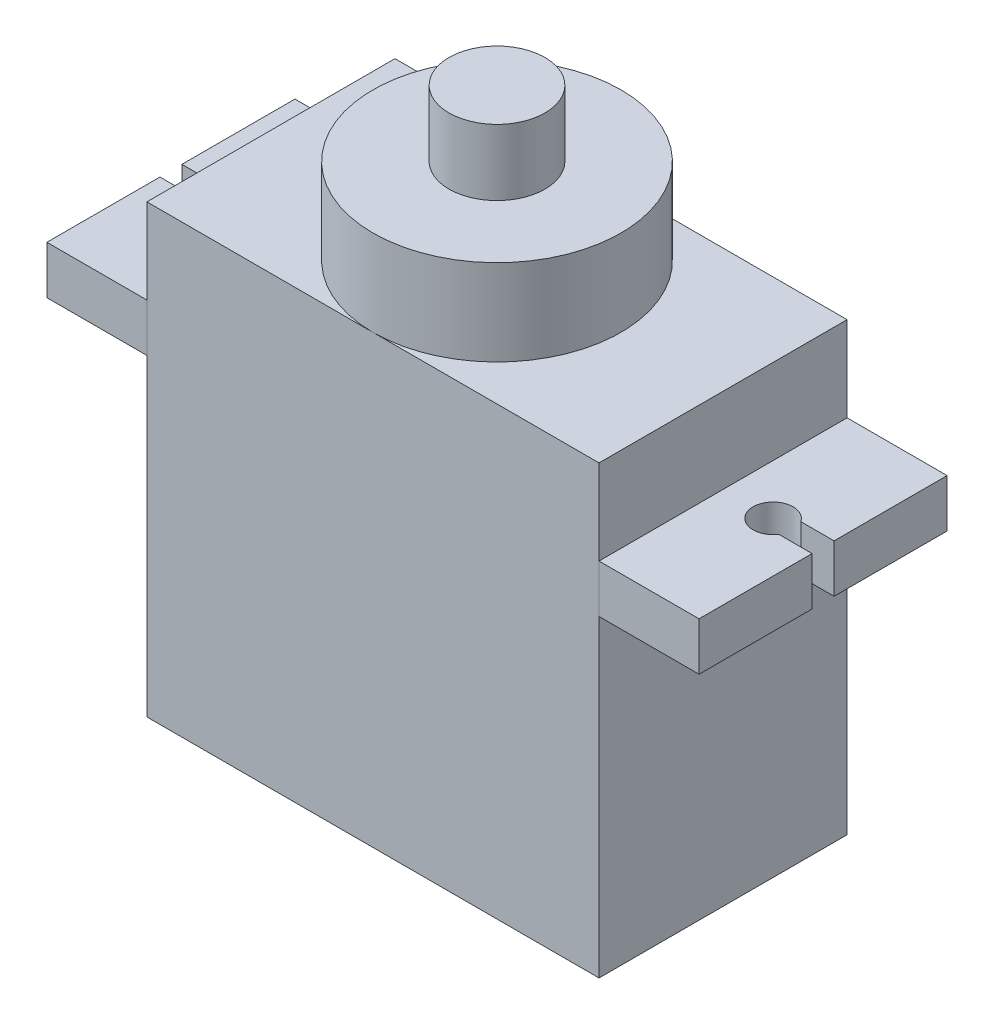
ISO-10303-21;
HEADER;
FILE_DESCRIPTION(('STEP AP214'),'2;1');
FILE_NAME('part.step','',(''),(''),'','','');
FILE_SCHEMA(('AUTOMOTIVE_DESIGN { 1 0 10303 214 1 1 1 1 }'));
ENDSEC;
DATA;
#1=APPLICATION_CONTEXT('core data for automotive mechanical design processes');
#2=APPLICATION_PROTOCOL_DEFINITION('international standard','automotive_design',2000,#1);
#3=PRODUCT_CONTEXT('',#1,'mechanical');
#4=PRODUCT('Part','Part','',(#3));
#5=PRODUCT_RELATED_PRODUCT_CATEGORY('part','',(#4));
#6=PRODUCT_DEFINITION_FORMATION('','',#4);
#7=PRODUCT_DEFINITION_CONTEXT('part definition',#1,'design');
#8=PRODUCT_DEFINITION('design','',#6,#7);
#9=PRODUCT_DEFINITION_SHAPE('','',#8);
#10=(LENGTH_UNIT() NAMED_UNIT(*) SI_UNIT(.MILLI.,.METRE.));
#11=(NAMED_UNIT(*) PLANE_ANGLE_UNIT() SI_UNIT($,.RADIAN.));
#12=(NAMED_UNIT(*) SI_UNIT($,.STERADIAN.) SOLID_ANGLE_UNIT());
#13=UNCERTAINTY_MEASURE_WITH_UNIT(LENGTH_MEASURE(1.E-05),#10,'distance_accuracy_value','');
#14=(GEOMETRIC_REPRESENTATION_CONTEXT(3) GLOBAL_UNCERTAINTY_ASSIGNED_CONTEXT((#13)) GLOBAL_UNIT_ASSIGNED_CONTEXT((#10,
#11,#12)) REPRESENTATION_CONTEXT('',''));
#15=CARTESIAN_POINT('',(0.,0.,0.));
#16=DIRECTION('',(0.,0.,1.));
#17=DIRECTION('',(1.,0.,0.));
#18=AXIS2_PLACEMENT_3D('',#15,#16,#17);
#19=CARTESIAN_POINT('',(-13.6,4.5,-1.2));
#20=DIRECTION('',(1.,0.,0.));
#21=DIRECTION('',(0.,0.,-1.));
#22=AXIS2_PLACEMENT_3D('',#19,#20,#21);
#23=CYLINDRICAL_SURFACE('',#22,0.6);
#24=CARTESIAN_POINT('',(-11.3,4.5,-1.2));
#25=DIRECTION('',(-1.,0.,0.));
#26=DIRECTION('',(0.,0.,1.));
#27=AXIS2_PLACEMENT_3D('',#24,#25,#26);
#28=CIRCLE('',#27,0.6);
#29=CARTESIAN_POINT('',(-11.3,4.5,-0.6));
#30=VERTEX_POINT('',#29);
#31=EDGE_CURVE('E11',#30,#30,#28,.T.);
#32=ORIENTED_EDGE('',*,*,#31,.T.);
#33=EDGE_LOOP('',(#32));
#34=FACE_BOUND('',#33,.T.);
#35=CARTESIAN_POINT('',(-13.6,4.5,-1.2));
#36=DIRECTION('',(-1.,0.,0.));
#37=DIRECTION('',(0.,0.,1.));
#38=AXIS2_PLACEMENT_3D('',#35,#36,#37);
#39=CIRCLE('',#38,0.6);
#40=CARTESIAN_POINT('',(-13.6,4.5,-0.6));
#41=VERTEX_POINT('',#40);
#42=EDGE_CURVE('E60',#41,#41,#39,.T.);
#43=ORIENTED_EDGE('',*,*,#42,.F.);
#44=EDGE_LOOP('',(#43));
#45=FACE_BOUND('',#44,.T.);
#46=ADVANCED_FACE('F56',(#34,#45),#23,.T.);
#47=CARTESIAN_POINT('',(-13.6,0.,0.));
#48=DIRECTION('',(-1.,0.,0.));
#49=DIRECTION('',(0.,0.,1.));
#50=AXIS2_PLACEMENT_3D('',#47,#48,#49);
#51=PLANE('',#50);
#52=ORIENTED_EDGE('',*,*,#42,.T.);
#53=EDGE_LOOP('',(#52));
#54=FACE_BOUND('',#53,.T.);
#55=ADVANCED_FACE('F58',(#54),#51,.T.);
#56=CARTESIAN_POINT('',(-11.3,0.,0.));
#57=DIRECTION('',(-1.,0.,0.));
#58=DIRECTION('',(0.,0.,1.));
#59=AXIS2_PLACEMENT_3D('',#56,#57,#58);
#60=PLANE('',#59);
#61=ORIENTED_EDGE('',*,*,#31,.F.);
#62=EDGE_LOOP('',(#61));
#63=FACE_BOUND('',#62,.T.);
#64=ADVANCED_FACE('F75',(#63),#60,.F.);
#65=CLOSED_SHELL('',(#46,#55,#64));
#66=MANIFOLD_SOLID_BREP('B2',#65);
#67=CARTESIAN_POINT('',(-13.6,4.5,0.));
#68=DIRECTION('',(1.,0.,0.));
#69=DIRECTION('',(0.,0.,-1.));
#70=AXIS2_PLACEMENT_3D('',#67,#68,#69);
#71=CYLINDRICAL_SURFACE('',#70,0.6);
#72=CARTESIAN_POINT('',(-11.3,4.5,0.));
#73=DIRECTION('',(-1.,0.,0.));
#74=DIRECTION('',(0.,0.,1.));
#75=AXIS2_PLACEMENT_3D('',#72,#73,#74);
#76=CIRCLE('',#75,0.6);
#77=CARTESIAN_POINT('',(-11.3,4.5,0.6));
#78=VERTEX_POINT('',#77);
#79=EDGE_CURVE('E55',#78,#78,#76,.T.);
#80=ORIENTED_EDGE('',*,*,#79,.T.);
#81=EDGE_LOOP('',(#80));
#82=FACE_BOUND('',#81,.T.);
#83=CARTESIAN_POINT('',(-13.6,4.5,0.));
#84=DIRECTION('',(-1.,0.,0.));
#85=DIRECTION('',(0.,0.,1.));
#86=AXIS2_PLACEMENT_3D('',#83,#84,#85);
#87=CIRCLE('',#86,0.6);
#88=CARTESIAN_POINT('',(-13.6,4.5,0.6));
#89=VERTEX_POINT('',#88);
#90=EDGE_CURVE('E109',#89,#89,#87,.T.);
#91=ORIENTED_EDGE('',*,*,#90,.F.);
#92=EDGE_LOOP('',(#91));
#93=FACE_BOUND('',#92,.T.);
#94=ADVANCED_FACE('F105',(#82,#93),#71,.T.);
#95=CARTESIAN_POINT('',(-13.6,0.,0.));
#96=DIRECTION('',(-1.,0.,0.));
#97=DIRECTION('',(0.,0.,1.));
#98=AXIS2_PLACEMENT_3D('',#95,#96,#97);
#99=PLANE('',#98);
#100=ORIENTED_EDGE('',*,*,#90,.T.);
#101=EDGE_LOOP('',(#100));
#102=FACE_BOUND('',#101,.T.);
#103=ADVANCED_FACE('F107',(#102),#99,.T.);
#104=CARTESIAN_POINT('',(-11.3,0.,0.));
#105=DIRECTION('',(-1.,0.,0.));
#106=DIRECTION('',(0.,0.,1.));
#107=AXIS2_PLACEMENT_3D('',#104,#105,#106);
#108=PLANE('',#107);
#109=ORIENTED_EDGE('',*,*,#79,.F.);
#110=EDGE_LOOP('',(#109));
#111=FACE_BOUND('',#110,.T.);
#112=ADVANCED_FACE('F124',(#111),#108,.F.);
#113=CLOSED_SHELL('',(#94,#103,#112));
#114=MANIFOLD_SOLID_BREP('B6',#113);
#115=CARTESIAN_POINT('',(-13.6,4.5,1.2));
#116=DIRECTION('',(1.,0.,0.));
#117=DIRECTION('',(0.,0.,-1.));
#118=AXIS2_PLACEMENT_3D('',#115,#116,#117);
#119=CYLINDRICAL_SURFACE('',#118,0.6);
#120=CARTESIAN_POINT('',(-11.3,4.5,1.2));
#121=DIRECTION('',(-1.,0.,0.));
#122=DIRECTION('',(0.,0.,1.));
#123=AXIS2_PLACEMENT_3D('',#120,#121,#122);
#124=CIRCLE('',#123,0.6);
#125=CARTESIAN_POINT('',(-11.3,4.5,1.8));
#126=VERTEX_POINT('',#125);
#127=EDGE_CURVE('E159',#126,#126,#124,.T.);
#128=ORIENTED_EDGE('',*,*,#127,.T.);
#129=EDGE_LOOP('',(#128));
#130=FACE_BOUND('',#129,.T.);
#131=CARTESIAN_POINT('',(-13.6,4.5,1.2));
#132=DIRECTION('',(-1.,0.,0.));
#133=DIRECTION('',(0.,0.,1.));
#134=AXIS2_PLACEMENT_3D('',#131,#132,#133);
#135=CIRCLE('',#134,0.6);
#136=CARTESIAN_POINT('',(-13.6,4.5,1.8));
#137=VERTEX_POINT('',#136);
#138=EDGE_CURVE('E104',#137,#137,#135,.T.);
#139=ORIENTED_EDGE('',*,*,#138,.F.);
#140=EDGE_LOOP('',(#139));
#141=FACE_BOUND('',#140,.T.);
#142=ADVANCED_FACE('F156',(#130,#141),#119,.T.);
#143=CARTESIAN_POINT('',(-13.6,4.5,1.2));
#144=DIRECTION('',(-1.,0.,0.));
#145=DIRECTION('',(0.,0.,1.));
#146=AXIS2_PLACEMENT_3D('',#143,#144,#145);
#147=PLANE('',#146);
#148=ORIENTED_EDGE('',*,*,#138,.T.);
#149=EDGE_LOOP('',(#148));
#150=FACE_BOUND('',#149,.T.);
#151=ADVANCED_FACE('F172',(#150),#147,.T.);
#152=CARTESIAN_POINT('',(-11.3,4.5,1.2));
#153=DIRECTION('',(-1.,0.,0.));
#154=DIRECTION('',(0.,0.,1.));
#155=AXIS2_PLACEMENT_3D('',#152,#153,#154);
#156=PLANE('',#155);
#157=ORIENTED_EDGE('',*,*,#127,.F.);
#158=EDGE_LOOP('',(#157));
#159=FACE_BOUND('',#158,.T.);
#160=ADVANCED_FACE('F170',(#159),#156,.F.);
#161=CLOSED_SHELL('',(#142,#151,#160));
#162=MANIFOLD_SOLID_BREP('B50',#161);
#163=CARTESIAN_POINT('',(-16.3,18.05,-6.2));
#164=DIRECTION('',(-1.,0.,0.));
#165=DIRECTION('',(0.,0.,1.));
#166=AXIS2_PLACEMENT_3D('',#163,#164,#165);
#167=PLANE('',#166);
#168=DIRECTION('',(0.,1.,0.));
#169=VECTOR('',#168,1.);
#170=CARTESIAN_POINT('',(-16.3,0.,0.550000000000012));
#171=LINE('',#170,#169);
#172=CARTESIAN_POINT('',(-16.3,15.65,0.550000000000012));
#173=VERTEX_POINT('',#172);
#174=CARTESIAN_POINT('',(-16.3,18.05,0.550000000000012));
#175=VERTEX_POINT('',#174);
#176=EDGE_CURVE('E295',#173,#175,#171,.T.);
#177=ORIENTED_EDGE('',*,*,#176,.F.);
#178=DIRECTION('',(0.,0.,1.));
#179=VECTOR('',#178,1.);
#180=CARTESIAN_POINT('',(-16.3,15.65,-6.2));
#181=LINE('',#180,#179);
#182=CARTESIAN_POINT('',(-16.3,15.65,6.2));
#183=VERTEX_POINT('',#182);
#184=EDGE_CURVE('E300',#173,#183,#181,.T.);
#185=ORIENTED_EDGE('',*,*,#184,.T.);
#186=DIRECTION('',(0.,-1.,0.));
#187=VECTOR('',#186,1.);
#188=CARTESIAN_POINT('',(-16.3,18.05,6.2));
#189=LINE('',#188,#187);
#190=CARTESIAN_POINT('',(-16.3,18.05,6.2));
#191=VERTEX_POINT('',#190);
#192=EDGE_CURVE('E308',#191,#183,#189,.T.);
#193=ORIENTED_EDGE('',*,*,#192,.F.);
#194=DIRECTION('',(0.,0.,1.));
#195=VECTOR('',#194,1.);
#196=CARTESIAN_POINT('',(-16.3,18.05,-6.2));
#197=LINE('',#196,#195);
#198=EDGE_CURVE('E301',#175,#191,#197,.T.);
#199=ORIENTED_EDGE('',*,*,#198,.F.);
#200=EDGE_LOOP('',(#177,#185,#193,#199));
#201=FACE_BOUND('',#200,.T.);
#202=ADVANCED_FACE('F207',(#201),#167,.T.);
#203=CARTESIAN_POINT('',(-11.3,18.05,-6.2));
#204=DIRECTION('',(1.,0.,0.));
#205=DIRECTION('',(0.,0.,-1.));
#206=AXIS2_PLACEMENT_3D('',#203,#204,#205);
#207=PLANE('',#206);
#208=DIRECTION('',(0.,1.,0.));
#209=VECTOR('',#208,1.);
#210=CARTESIAN_POINT('',(-11.3,18.05,6.2));
#211=LINE('',#210,#209);
#212=CARTESIAN_POINT('',(-11.3,15.65,6.2));
#213=VERTEX_POINT('',#212);
#214=CARTESIAN_POINT('',(-11.3,18.05,6.2));
#215=VERTEX_POINT('',#214);
#216=EDGE_CURVE('E314',#213,#215,#211,.T.);
#217=ORIENTED_EDGE('',*,*,#216,.F.);
#218=DIRECTION('',(0.,0.,1.));
#219=VECTOR('',#218,1.);
#220=CARTESIAN_POINT('',(-11.3,15.65,-6.2));
#221=LINE('',#220,#219);
#222=CARTESIAN_POINT('',(-11.3,15.65,-6.2));
#223=VERTEX_POINT('',#222);
#224=EDGE_CURVE('E154',#223,#213,#221,.T.);
#225=ORIENTED_EDGE('',*,*,#224,.F.);
#226=DIRECTION('',(0.,1.,0.));
#227=VECTOR('',#226,1.);
#228=CARTESIAN_POINT('',(-11.3,18.05,-6.2));
#229=LINE('',#228,#227);
#230=CARTESIAN_POINT('',(-11.3,18.05,-6.2));
#231=VERTEX_POINT('',#230);
#232=EDGE_CURVE('E307',#223,#231,#229,.T.);
#233=ORIENTED_EDGE('',*,*,#232,.T.);
#234=DIRECTION('',(0.,0.,1.));
#235=VECTOR('',#234,1.);
#236=CARTESIAN_POINT('',(-11.3,18.05,-6.2));
#237=LINE('',#236,#235);
#238=EDGE_CURVE('E211',#231,#215,#237,.T.);
#239=ORIENTED_EDGE('',*,*,#238,.T.);
#240=EDGE_LOOP('',(#217,#225,#233,#239));
#241=FACE_BOUND('',#240,.T.);
#242=ADVANCED_FACE('F209',(#241),#207,.T.);
#243=CARTESIAN_POINT('',(-11.3,15.65,-6.2));
#244=DIRECTION('',(0.,-1.,0.));
#245=DIRECTION('',(0.,0.,-1.));
#246=AXIS2_PLACEMENT_3D('',#243,#244,#245);
#247=PLANE('',#246);
#248=DIRECTION('',(-1.,0.,0.));
#249=VECTOR('',#248,1.);
#250=CARTESIAN_POINT('',(-11.3,15.65,0.55000000000001));
#251=LINE('',#250,#249);
#252=CARTESIAN_POINT('',(-14.6351646544245,15.65,0.550000000000011));
#253=VERTEX_POINT('',#252);
#254=EDGE_CURVE('E325',#253,#173,#251,.T.);
#255=ORIENTED_EDGE('',*,*,#254,.F.);
#256=CARTESIAN_POINT('',(-13.8,15.65,0.));
#257=DIRECTION('',(0.,-1.,0.));
#258=DIRECTION('',(0.,0.,-1.));
#259=AXIS2_PLACEMENT_3D('',#256,#257,#258);
#260=CIRCLE('',#259,1.);
#261=CARTESIAN_POINT('',(-14.6351646544245,15.65,-0.550000000000004));
#262=VERTEX_POINT('',#261);
#263=EDGE_CURVE('E317',#262,#253,#260,.T.);
#264=ORIENTED_EDGE('',*,*,#263,.F.);
#265=DIRECTION('',(1.,0.,0.));
#266=VECTOR('',#265,1.);
#267=CARTESIAN_POINT('',(-11.3,15.65,-0.550000000000004));
#268=LINE('',#267,#266);
#269=CARTESIAN_POINT('',(-16.3,15.65,-0.550000000000004));
#270=VERTEX_POINT('',#269);
#271=EDGE_CURVE('E327',#270,#262,#268,.T.);
#272=ORIENTED_EDGE('',*,*,#271,.F.);
#273=CARTESIAN_POINT('',(-16.3,15.65,-6.2));
#274=VERTEX_POINT('',#273);
#275=EDGE_CURVE('E216',#274,#270,#181,.T.);
#276=ORIENTED_EDGE('',*,*,#275,.F.);
#277=DIRECTION('',(1.,0.,0.));
#278=VECTOR('',#277,1.);
#279=CARTESIAN_POINT('',(-11.3,15.65,-6.2));
#280=LINE('',#279,#278);
#281=EDGE_CURVE('E318',#274,#223,#280,.T.);
#282=ORIENTED_EDGE('',*,*,#281,.T.);
#283=ORIENTED_EDGE('',*,*,#224,.T.);
#284=DIRECTION('',(1.,0.,0.));
#285=VECTOR('',#284,1.);
#286=CARTESIAN_POINT('',(-11.3,15.65,6.2));
#287=LINE('',#286,#285);
#288=EDGE_CURVE('E304',#183,#213,#287,.T.);
#289=ORIENTED_EDGE('',*,*,#288,.F.);
#290=ORIENTED_EDGE('',*,*,#184,.F.);
#291=EDGE_LOOP('',(#255,#264,#272,#276,#282,#283,#289,#290));
#292=FACE_BOUND('',#291,.T.);
#293=ADVANCED_FACE('F349',(#292),#247,.T.);
#294=DIRECTION('',(0.,1.,0.));
#295=VECTOR('',#294,1.);
#296=CARTESIAN_POINT('',(-16.3,0.,-0.550000000000004));
#297=LINE('',#296,#295);
#298=CARTESIAN_POINT('',(-16.3,18.05,-0.550000000000004));
#299=VERTEX_POINT('',#298);
#300=EDGE_CURVE('E283',#270,#299,#297,.T.);
#301=ORIENTED_EDGE('',*,*,#300,.T.);
#302=CARTESIAN_POINT('',(-16.3,18.05,-6.2));
#303=VERTEX_POINT('',#302);
#304=EDGE_CURVE('E293',#303,#299,#197,.T.);
#305=ORIENTED_EDGE('',*,*,#304,.F.);
#306=DIRECTION('',(0.,-1.,0.));
#307=VECTOR('',#306,1.);
#308=CARTESIAN_POINT('',(-16.3,18.05,-6.2));
#309=LINE('',#308,#307);
#310=EDGE_CURVE('E320',#303,#274,#309,.T.);
#311=ORIENTED_EDGE('',*,*,#310,.T.);
#312=ORIENTED_EDGE('',*,*,#275,.T.);
#313=EDGE_LOOP('',(#301,#305,#311,#312));
#314=FACE_BOUND('',#313,.T.);
#315=ADVANCED_FACE('F291',(#314),#167,.T.);
#316=CARTESIAN_POINT('',(-11.3,18.05,-6.2));
#317=DIRECTION('',(0.,1.,0.));
#318=DIRECTION('',(0.,0.,1.));
#319=AXIS2_PLACEMENT_3D('',#316,#317,#318);
#320=PLANE('',#319);
#321=DIRECTION('',(1.,0.,0.));
#322=VECTOR('',#321,1.);
#323=CARTESIAN_POINT('',(-14.6351646544245,18.05,0.550000000000011));
#324=LINE('',#323,#322);
#325=CARTESIAN_POINT('',(-14.6351646544245,18.05,0.550000000000011));
#326=VERTEX_POINT('',#325);
#327=EDGE_CURVE('E287',#175,#326,#324,.T.);
#328=ORIENTED_EDGE('',*,*,#327,.F.);
#329=ORIENTED_EDGE('',*,*,#198,.T.);
#330=DIRECTION('',(-1.,0.,0.));
#331=VECTOR('',#330,1.);
#332=CARTESIAN_POINT('',(-11.3,18.05,6.2));
#333=LINE('',#332,#331);
#334=EDGE_CURVE('E311',#215,#191,#333,.T.);
#335=ORIENTED_EDGE('',*,*,#334,.F.);
#336=ORIENTED_EDGE('',*,*,#238,.F.);
#337=DIRECTION('',(-1.,0.,0.));
#338=VECTOR('',#337,1.);
#339=CARTESIAN_POINT('',(-11.3,18.05,-6.2));
#340=LINE('',#339,#338);
#341=EDGE_CURVE('E299',#231,#303,#340,.T.);
#342=ORIENTED_EDGE('',*,*,#341,.T.);
#343=ORIENTED_EDGE('',*,*,#304,.T.);
#344=DIRECTION('',(-1.,0.,0.));
#345=VECTOR('',#344,1.);
#346=CARTESIAN_POINT('',(-16.3,18.05,-0.550000000000004));
#347=LINE('',#346,#345);
#348=CARTESIAN_POINT('',(-14.6351646544245,18.05,-0.550000000000004));
#349=VERTEX_POINT('',#348);
#350=EDGE_CURVE('E280',#349,#299,#347,.T.);
#351=ORIENTED_EDGE('',*,*,#350,.F.);
#352=CARTESIAN_POINT('',(-13.8,18.05,0.));
#353=DIRECTION('',(0.,1.,0.));
#354=DIRECTION('',(0.,0.,-1.));
#355=AXIS2_PLACEMENT_3D('',#352,#353,#354);
#356=CIRCLE('',#355,1.);
#357=EDGE_CURVE('E224',#326,#349,#356,.T.);
#358=ORIENTED_EDGE('',*,*,#357,.F.);
#359=EDGE_LOOP('',(#328,#329,#335,#336,#342,#343,#351,#358));
#360=FACE_BOUND('',#359,.T.);
#361=ADVANCED_FACE('F298',(#360),#320,.T.);
#362=CARTESIAN_POINT('',(0.,0.,-6.2));
#363=DIRECTION('',(0.,0.,-1.));
#364=DIRECTION('',(-1.,0.,0.));
#365=AXIS2_PLACEMENT_3D('',#362,#363,#364);
#366=PLANE('',#365);
#367=ORIENTED_EDGE('',*,*,#232,.F.);
#368=ORIENTED_EDGE('',*,*,#281,.F.);
#369=ORIENTED_EDGE('',*,*,#310,.F.);
#370=ORIENTED_EDGE('',*,*,#341,.F.);
#371=EDGE_LOOP('',(#367,#368,#369,#370));
#372=FACE_BOUND('',#371,.T.);
#373=ADVANCED_FACE('F348',(#372),#366,.T.);
#374=CARTESIAN_POINT('',(0.,0.,6.2));
#375=DIRECTION('',(0.,0.,-1.));
#376=DIRECTION('',(-1.,0.,0.));
#377=AXIS2_PLACEMENT_3D('',#374,#375,#376);
#378=PLANE('',#377);
#379=ORIENTED_EDGE('',*,*,#216,.T.);
#380=ORIENTED_EDGE('',*,*,#334,.T.);
#381=ORIENTED_EDGE('',*,*,#192,.T.);
#382=ORIENTED_EDGE('',*,*,#288,.T.);
#383=EDGE_LOOP('',(#379,#380,#381,#382));
#384=FACE_BOUND('',#383,.T.);
#385=ADVANCED_FACE('F345',(#384),#378,.F.);
#386=CARTESIAN_POINT('',(-13.8,0.,0.));
#387=DIRECTION('',(0.,1.,0.));
#388=DIRECTION('',(0.,0.,1.));
#389=AXIS2_PLACEMENT_3D('',#386,#387,#388);
#390=CYLINDRICAL_SURFACE('',#389,1.);
#391=ORIENTED_EDGE('',*,*,#263,.T.);
#392=DIRECTION('',(0.,1.,0.));
#393=VECTOR('',#392,1.);
#394=CARTESIAN_POINT('',(-14.6351646544245,0.,0.550000000000011));
#395=LINE('',#394,#393);
#396=EDGE_CURVE('E329',#253,#326,#395,.T.);
#397=ORIENTED_EDGE('',*,*,#396,.T.);
#398=ORIENTED_EDGE('',*,*,#357,.T.);
#399=DIRECTION('',(0.,1.,0.));
#400=VECTOR('',#399,1.);
#401=CARTESIAN_POINT('',(-14.6351646544245,0.,-0.550000000000004));
#402=LINE('',#401,#400);
#403=EDGE_CURVE('E285',#262,#349,#402,.T.);
#404=ORIENTED_EDGE('',*,*,#403,.F.);
#405=EDGE_LOOP('',(#391,#397,#398,#404));
#406=FACE_BOUND('',#405,.T.);
#407=ADVANCED_FACE('F351',(#406),#390,.F.);
#408=CARTESIAN_POINT('',(-14.6351646544245,0.,0.550000000000011));
#409=DIRECTION('',(0.,0.,1.));
#410=DIRECTION('',(1.,0.,0.));
#411=AXIS2_PLACEMENT_3D('',#408,#409,#410);
#412=PLANE('',#411);
#413=ORIENTED_EDGE('',*,*,#254,.T.);
#414=ORIENTED_EDGE('',*,*,#176,.T.);
#415=ORIENTED_EDGE('',*,*,#327,.T.);
#416=ORIENTED_EDGE('',*,*,#396,.F.);
#417=EDGE_LOOP('',(#413,#414,#415,#416));
#418=FACE_BOUND('',#417,.T.);
#419=ADVANCED_FACE('F337',(#418),#412,.F.);
#420=CARTESIAN_POINT('',(-16.3,0.,-0.550000000000004));
#421=DIRECTION('',(0.,0.,-1.));
#422=DIRECTION('',(-1.,0.,0.));
#423=AXIS2_PLACEMENT_3D('',#420,#421,#422);
#424=PLANE('',#423);
#425=ORIENTED_EDGE('',*,*,#271,.T.);
#426=ORIENTED_EDGE('',*,*,#403,.T.);
#427=ORIENTED_EDGE('',*,*,#350,.T.);
#428=ORIENTED_EDGE('',*,*,#300,.F.);
#429=EDGE_LOOP('',(#425,#426,#427,#428));
#430=FACE_BOUND('',#429,.T.);
#431=ADVANCED_FACE('F282',(#430),#424,.F.);
#432=CLOSED_SHELL('',(#202,#242,#293,#315,#361,#373,#385,#407,#419,#431));
#433=MANIFOLD_SOLID_BREP('B99',#432);
#434=CARTESIAN_POINT('',(16.3,18.05,-6.2));
#435=DIRECTION('',(1.,0.,0.));
#436=DIRECTION('',(0.,0.,-1.));
#437=AXIS2_PLACEMENT_3D('',#434,#435,#436);
#438=PLANE('',#437);
#439=DIRECTION('',(0.,1.,0.));
#440=VECTOR('',#439,1.);
#441=CARTESIAN_POINT('',(16.3,0.,-0.550000000000004));
#442=LINE('',#441,#440);
#443=CARTESIAN_POINT('',(16.3,15.65,-0.550000000000004));
#444=VERTEX_POINT('',#443);
#445=CARTESIAN_POINT('',(16.3,18.05,-0.550000000000004));
#446=VERTEX_POINT('',#445);
#447=EDGE_CURVE('E538',#444,#446,#442,.T.);
#448=ORIENTED_EDGE('',*,*,#447,.F.);
#449=DIRECTION('',(0.,0.,1.));
#450=VECTOR('',#449,1.);
#451=CARTESIAN_POINT('',(16.3,15.65,-6.2));
#452=LINE('',#451,#450);
#453=CARTESIAN_POINT('',(16.3,15.65,-6.2));
#454=VERTEX_POINT('',#453);
#455=EDGE_CURVE('E565',#454,#444,#452,.T.);
#456=ORIENTED_EDGE('',*,*,#455,.F.);
#457=DIRECTION('',(0.,1.,0.));
#458=VECTOR('',#457,1.);
#459=CARTESIAN_POINT('',(16.3,18.05,-6.2));
#460=LINE('',#459,#458);
#461=CARTESIAN_POINT('',(16.3,18.05,-6.2));
#462=VERTEX_POINT('',#461);
#463=EDGE_CURVE('E546',#454,#462,#460,.T.);
#464=ORIENTED_EDGE('',*,*,#463,.T.);
#465=DIRECTION('',(0.,0.,1.));
#466=VECTOR('',#465,1.);
#467=CARTESIAN_POINT('',(16.3,18.05,-6.2));
#468=LINE('',#467,#466);
#469=EDGE_CURVE('E562',#462,#446,#468,.T.);
#470=ORIENTED_EDGE('',*,*,#469,.T.);
#471=EDGE_LOOP('',(#448,#456,#464,#470));
#472=FACE_BOUND('',#471,.T.);
#473=ADVANCED_FACE('F441',(#472),#438,.T.);
#474=CARTESIAN_POINT('',(11.3,18.05,-6.2));
#475=DIRECTION('',(-1.,0.,0.));
#476=DIRECTION('',(0.,0.,1.));
#477=AXIS2_PLACEMENT_3D('',#474,#475,#476);
#478=PLANE('',#477);
#479=DIRECTION('',(0.,-1.,0.));
#480=VECTOR('',#479,1.);
#481=CARTESIAN_POINT('',(11.3,18.05,6.2));
#482=LINE('',#481,#480);
#483=CARTESIAN_POINT('',(11.3,18.05,6.2));
#484=VERTEX_POINT('',#483);
#485=CARTESIAN_POINT('',(11.3,15.65,6.2));
#486=VERTEX_POINT('',#485);
#487=EDGE_CURVE('E537',#484,#486,#482,.T.);
#488=ORIENTED_EDGE('',*,*,#487,.F.);
#489=DIRECTION('',(0.,0.,1.));
#490=VECTOR('',#489,1.);
#491=CARTESIAN_POINT('',(11.3,18.05,-6.2));
#492=LINE('',#491,#490);
#493=CARTESIAN_POINT('',(11.3,18.05,-6.2));
#494=VERTEX_POINT('',#493);
#495=EDGE_CURVE('E465',#494,#484,#492,.T.);
#496=ORIENTED_EDGE('',*,*,#495,.F.);
#497=DIRECTION('',(0.,-1.,0.));
#498=VECTOR('',#497,1.);
#499=CARTESIAN_POINT('',(11.3,18.05,-6.2));
#500=LINE('',#499,#498);
#501=CARTESIAN_POINT('',(11.3,15.65,-6.2));
#502=VERTEX_POINT('',#501);
#503=EDGE_CURVE('E541',#494,#502,#500,.T.);
#504=ORIENTED_EDGE('',*,*,#503,.T.);
#505=DIRECTION('',(0.,0.,1.));
#506=VECTOR('',#505,1.);
#507=CARTESIAN_POINT('',(11.3,15.65,-6.2));
#508=LINE('',#507,#506);
#509=EDGE_CURVE('E491',#502,#486,#508,.T.);
#510=ORIENTED_EDGE('',*,*,#509,.T.);
#511=EDGE_LOOP('',(#488,#496,#504,#510));
#512=FACE_BOUND('',#511,.T.);
#513=ADVANCED_FACE('F443',(#512),#478,.T.);
#514=CARTESIAN_POINT('',(11.3,18.05,-6.2));
#515=DIRECTION('',(0.,1.,0.));
#516=DIRECTION('',(0.,0.,1.));
#517=AXIS2_PLACEMENT_3D('',#514,#515,#516);
#518=PLANE('',#517);
#519=DIRECTION('',(-1.,0.,0.));
#520=VECTOR('',#519,1.);
#521=CARTESIAN_POINT('',(14.6351646544245,18.05,-0.550000000000004));
#522=LINE('',#521,#520);
#523=CARTESIAN_POINT('',(14.6351646544245,18.05,-0.550000000000004));
#524=VERTEX_POINT('',#523);
#525=EDGE_CURVE('E520',#446,#524,#522,.T.);
#526=ORIENTED_EDGE('',*,*,#525,.F.);
#527=ORIENTED_EDGE('',*,*,#469,.F.);
#528=DIRECTION('',(-1.,0.,0.));
#529=VECTOR('',#528,1.);
#530=CARTESIAN_POINT('',(11.3,18.05,-6.2));
#531=LINE('',#530,#529);
#532=EDGE_CURVE('E549',#462,#494,#531,.T.);
#533=ORIENTED_EDGE('',*,*,#532,.T.);
#534=ORIENTED_EDGE('',*,*,#495,.T.);
#535=DIRECTION('',(-1.,0.,0.));
#536=VECTOR('',#535,1.);
#537=CARTESIAN_POINT('',(11.3,18.05,6.2));
#538=LINE('',#537,#536);
#539=CARTESIAN_POINT('',(16.3,18.05,6.2));
#540=VERTEX_POINT('',#539);
#541=EDGE_CURVE('E544',#540,#484,#538,.T.);
#542=ORIENTED_EDGE('',*,*,#541,.F.);
#543=CARTESIAN_POINT('',(16.3,18.05,0.549999999999996));
#544=VERTEX_POINT('',#543);
#545=EDGE_CURVE('E532',#544,#540,#468,.T.);
#546=ORIENTED_EDGE('',*,*,#545,.F.);
#547=DIRECTION('',(1.,0.,0.));
#548=VECTOR('',#547,1.);
#549=CARTESIAN_POINT('',(16.3,18.05,0.549999999999996));
#550=LINE('',#549,#548);
#551=CARTESIAN_POINT('',(14.6351646544245,18.05,0.549999999999997));
#552=VERTEX_POINT('',#551);
#553=EDGE_CURVE('E516',#552,#544,#550,.T.);
#554=ORIENTED_EDGE('',*,*,#553,.F.);
#555=CARTESIAN_POINT('',(13.8,18.05,0.));
#556=DIRECTION('',(0.,1.,0.));
#557=DIRECTION('',(0.,0.,1.));
#558=AXIS2_PLACEMENT_3D('',#555,#556,#557);
#559=CIRCLE('',#558,1.);
#560=EDGE_CURVE('E523',#524,#552,#559,.T.);
#561=ORIENTED_EDGE('',*,*,#560,.F.);
#562=EDGE_LOOP('',(#526,#527,#533,#534,#542,#546,#554,#561));
#563=FACE_BOUND('',#562,.T.);
#564=ADVANCED_FACE('F531',(#563),#518,.T.);
#565=DIRECTION('',(0.,1.,0.));
#566=VECTOR('',#565,1.);
#567=CARTESIAN_POINT('',(16.3,0.,0.549999999999996));
#568=LINE('',#567,#566);
#569=CARTESIAN_POINT('',(16.3,15.65,0.549999999999994));
#570=VERTEX_POINT('',#569);
#571=EDGE_CURVE('E456',#570,#544,#568,.T.);
#572=ORIENTED_EDGE('',*,*,#571,.T.);
#573=ORIENTED_EDGE('',*,*,#545,.T.);
#574=DIRECTION('',(0.,1.,0.));
#575=VECTOR('',#574,1.);
#576=CARTESIAN_POINT('',(16.3,18.05,6.2));
#577=LINE('',#576,#575);
#578=CARTESIAN_POINT('',(16.3,15.65,6.2));
#579=VERTEX_POINT('',#578);
#580=EDGE_CURVE('E556',#579,#540,#577,.T.);
#581=ORIENTED_EDGE('',*,*,#580,.F.);
#582=EDGE_CURVE('E568',#570,#579,#452,.T.);
#583=ORIENTED_EDGE('',*,*,#582,.F.);
#584=EDGE_LOOP('',(#572,#573,#581,#583));
#585=FACE_BOUND('',#584,.T.);
#586=ADVANCED_FACE('F585',(#585),#438,.T.);
#587=CARTESIAN_POINT('',(11.3,15.65,-6.2));
#588=DIRECTION('',(0.,-1.,0.));
#589=DIRECTION('',(0.,0.,-1.));
#590=AXIS2_PLACEMENT_3D('',#587,#588,#589);
#591=PLANE('',#590);
#592=DIRECTION('',(1.,0.,0.));
#593=VECTOR('',#592,1.);
#594=CARTESIAN_POINT('',(11.3,15.65,-0.550000000000004));
#595=LINE('',#594,#593);
#596=CARTESIAN_POINT('',(14.6351646544245,15.65,-0.550000000000004));
#597=VERTEX_POINT('',#596);
#598=EDGE_CURVE('E205',#597,#444,#595,.T.);
#599=ORIENTED_EDGE('',*,*,#598,.F.);
#600=CARTESIAN_POINT('',(13.8,15.65,0.));
#601=DIRECTION('',(0.,-1.,0.));
#602=DIRECTION('',(0.,0.,-1.));
#603=AXIS2_PLACEMENT_3D('',#600,#601,#602);
#604=CIRCLE('',#603,1.);
#605=CARTESIAN_POINT('',(14.6351646544245,15.65,0.549999999999997));
#606=VERTEX_POINT('',#605);
#607=EDGE_CURVE('E449',#606,#597,#604,.T.);
#608=ORIENTED_EDGE('',*,*,#607,.F.);
#609=DIRECTION('',(-1.,0.,0.));
#610=VECTOR('',#609,1.);
#611=CARTESIAN_POINT('',(11.3,15.65,0.549999999999998));
#612=LINE('',#611,#610);
#613=EDGE_CURVE('E517',#570,#606,#612,.T.);
#614=ORIENTED_EDGE('',*,*,#613,.F.);
#615=ORIENTED_EDGE('',*,*,#582,.T.);
#616=DIRECTION('',(1.,0.,0.));
#617=VECTOR('',#616,1.);
#618=CARTESIAN_POINT('',(11.3,15.65,6.2));
#619=LINE('',#618,#617);
#620=EDGE_CURVE('E553',#486,#579,#619,.T.);
#621=ORIENTED_EDGE('',*,*,#620,.F.);
#622=ORIENTED_EDGE('',*,*,#509,.F.);
#623=DIRECTION('',(1.,0.,0.));
#624=VECTOR('',#623,1.);
#625=CARTESIAN_POINT('',(11.3,15.65,-6.2));
#626=LINE('',#625,#624);
#627=EDGE_CURVE('E543',#502,#454,#626,.T.);
#628=ORIENTED_EDGE('',*,*,#627,.T.);
#629=ORIENTED_EDGE('',*,*,#455,.T.);
#630=EDGE_LOOP('',(#599,#608,#614,#615,#621,#622,#628,#629));
#631=FACE_BOUND('',#630,.T.);
#632=ADVANCED_FACE('F574',(#631),#591,.T.);
#633=CARTESIAN_POINT('',(0.,0.,-6.2));
#634=DIRECTION('',(0.,0.,1.));
#635=DIRECTION('',(1.,0.,0.));
#636=AXIS2_PLACEMENT_3D('',#633,#634,#635);
#637=PLANE('',#636);
#638=ORIENTED_EDGE('',*,*,#503,.F.);
#639=ORIENTED_EDGE('',*,*,#532,.F.);
#640=ORIENTED_EDGE('',*,*,#463,.F.);
#641=ORIENTED_EDGE('',*,*,#627,.F.);
#642=EDGE_LOOP('',(#638,#639,#640,#641));
#643=FACE_BOUND('',#642,.T.);
#644=ADVANCED_FACE('F579',(#643),#637,.F.);
#645=CARTESIAN_POINT('',(0.,0.,6.2));
#646=DIRECTION('',(0.,0.,1.));
#647=DIRECTION('',(1.,0.,0.));
#648=AXIS2_PLACEMENT_3D('',#645,#646,#647);
#649=PLANE('',#648);
#650=ORIENTED_EDGE('',*,*,#487,.T.);
#651=ORIENTED_EDGE('',*,*,#620,.T.);
#652=ORIENTED_EDGE('',*,*,#580,.T.);
#653=ORIENTED_EDGE('',*,*,#541,.T.);
#654=EDGE_LOOP('',(#650,#651,#652,#653));
#655=FACE_BOUND('',#654,.T.);
#656=ADVANCED_FACE('F583',(#655),#649,.T.);
#657=CARTESIAN_POINT('',(13.8,0.,0.));
#658=DIRECTION('',(0.,1.,0.));
#659=DIRECTION('',(0.,0.,1.));
#660=AXIS2_PLACEMENT_3D('',#657,#658,#659);
#661=CYLINDRICAL_SURFACE('',#660,1.);
#662=ORIENTED_EDGE('',*,*,#607,.T.);
#663=DIRECTION('',(0.,1.,0.));
#664=VECTOR('',#663,1.);
#665=CARTESIAN_POINT('',(14.6351646544245,0.,-0.550000000000004));
#666=LINE('',#665,#664);
#667=EDGE_CURVE('E526',#597,#524,#666,.T.);
#668=ORIENTED_EDGE('',*,*,#667,.T.);
#669=ORIENTED_EDGE('',*,*,#560,.T.);
#670=DIRECTION('',(0.,1.,0.));
#671=VECTOR('',#670,1.);
#672=CARTESIAN_POINT('',(14.6351646544245,0.,0.549999999999997));
#673=LINE('',#672,#671);
#674=EDGE_CURVE('E512',#606,#552,#673,.T.);
#675=ORIENTED_EDGE('',*,*,#674,.F.);
#676=EDGE_LOOP('',(#662,#668,#669,#675));
#677=FACE_BOUND('',#676,.T.);
#678=ADVANCED_FACE('F524',(#677),#661,.F.);
#679=CARTESIAN_POINT('',(14.6351646544245,0.,-0.550000000000004));
#680=DIRECTION('',(0.,0.,-1.));
#681=DIRECTION('',(-1.,0.,0.));
#682=AXIS2_PLACEMENT_3D('',#679,#680,#681);
#683=PLANE('',#682);
#684=ORIENTED_EDGE('',*,*,#598,.T.);
#685=ORIENTED_EDGE('',*,*,#447,.T.);
#686=ORIENTED_EDGE('',*,*,#525,.T.);
#687=ORIENTED_EDGE('',*,*,#667,.F.);
#688=EDGE_LOOP('',(#684,#685,#686,#687));
#689=FACE_BOUND('',#688,.T.);
#690=ADVANCED_FACE('F572',(#689),#683,.F.);
#691=CARTESIAN_POINT('',(16.3,0.,0.549999999999996));
#692=DIRECTION('',(0.,0.,1.));
#693=DIRECTION('',(1.,0.,0.));
#694=AXIS2_PLACEMENT_3D('',#691,#692,#693);
#695=PLANE('',#694);
#696=ORIENTED_EDGE('',*,*,#613,.T.);
#697=ORIENTED_EDGE('',*,*,#674,.T.);
#698=ORIENTED_EDGE('',*,*,#553,.T.);
#699=ORIENTED_EDGE('',*,*,#571,.F.);
#700=EDGE_LOOP('',(#696,#697,#698,#699));
#701=FACE_BOUND('',#700,.T.);
#702=ADVANCED_FACE('F514',(#701),#695,.F.);
#703=CLOSED_SHELL('',(#473,#513,#564,#586,#632,#644,#656,#678,#690,#702));
#704=MANIFOLD_SOLID_BREP('B148',#703);
#705=CARTESIAN_POINT('',(0.,22.3,0.));
#706=DIRECTION('',(0.,1.,0.));
#707=DIRECTION('',(0.,0.,1.));
#708=AXIS2_PLACEMENT_3D('',#705,#706,#707);
#709=PLANE('',#708);
#710=CARTESIAN_POINT('',(0.,22.3,0.));
#711=DIRECTION('',(0.,1.,0.));
#712=DIRECTION('',(0.,0.,1.));
#713=AXIS2_PLACEMENT_3D('',#710,#711,#712);
#714=CIRCLE('',#713,6.2);
#715=CARTESIAN_POINT('',(0.,22.3,6.2));
#716=VERTEX_POINT('',#715);
#717=CARTESIAN_POINT('',(0.,22.3,-6.2));
#718=VERTEX_POINT('',#717);
#719=EDGE_CURVE('E733',#716,#718,#714,.T.);
#720=ORIENTED_EDGE('',*,*,#719,.F.);
#721=DIRECTION('',(1.,0.,0.));
#722=VECTOR('',#721,1.);
#723=CARTESIAN_POINT('',(-11.3,22.3,6.2));
#724=LINE('',#723,#722);
#725=CARTESIAN_POINT('',(11.3,22.3,6.2));
#726=VERTEX_POINT('',#725);
#727=EDGE_CURVE('E691',#716,#726,#724,.T.);
#728=ORIENTED_EDGE('',*,*,#727,.T.);
#729=DIRECTION('',(0.,0.,-1.));
#730=VECTOR('',#729,1.);
#731=CARTESIAN_POINT('',(11.3,22.3,-6.2));
#732=LINE('',#731,#730);
#733=CARTESIAN_POINT('',(11.3,22.3,-6.2));
#734=VERTEX_POINT('',#733);
#735=EDGE_CURVE('E742',#726,#734,#732,.T.);
#736=ORIENTED_EDGE('',*,*,#735,.T.);
#737=DIRECTION('',(-1.,0.,0.));
#738=VECTOR('',#737,1.);
#739=CARTESIAN_POINT('',(-11.3,22.3,-6.2));
#740=LINE('',#739,#738);
#741=EDGE_CURVE('E720',#734,#718,#740,.T.);
#742=ORIENTED_EDGE('',*,*,#741,.T.);
#743=EDGE_LOOP('',(#720,#728,#736,#742));
#744=FACE_BOUND('',#743,.T.);
#745=ADVANCED_FACE('F666',(#744),#709,.T.);
#746=CARTESIAN_POINT('',(11.3,22.3,-6.2));
#747=DIRECTION('',(-1.,0.,0.));
#748=DIRECTION('',(0.,0.,1.));
#749=AXIS2_PLACEMENT_3D('',#746,#747,#748);
#750=PLANE('',#749);
#751=DIRECTION('',(0.,0.,-1.));
#752=VECTOR('',#751,1.);
#753=CARTESIAN_POINT('',(11.3,0.,-6.2));
#754=LINE('',#753,#752);
#755=CARTESIAN_POINT('',(11.3,0.,6.2));
#756=VERTEX_POINT('',#755);
#757=CARTESIAN_POINT('',(11.3,0.,-6.2));
#758=VERTEX_POINT('',#757);
#759=EDGE_CURVE('E747',#756,#758,#754,.T.);
#760=ORIENTED_EDGE('',*,*,#759,.T.);
#761=DIRECTION('',(0.,-1.,0.));
#762=VECTOR('',#761,1.);
#763=CARTESIAN_POINT('',(11.3,22.3,-6.2));
#764=LINE('',#763,#762);
#765=EDGE_CURVE('E670',#734,#758,#764,.T.);
#766=ORIENTED_EDGE('',*,*,#765,.F.);
#767=ORIENTED_EDGE('',*,*,#735,.F.);
#768=DIRECTION('',(0.,-1.,0.));
#769=VECTOR('',#768,1.);
#770=CARTESIAN_POINT('',(11.3,22.3,6.2));
#771=LINE('',#770,#769);
#772=EDGE_CURVE('E728',#726,#756,#771,.T.);
#773=ORIENTED_EDGE('',*,*,#772,.T.);
#774=EDGE_LOOP('',(#760,#766,#767,#773));
#775=FACE_BOUND('',#774,.T.);
#776=ADVANCED_FACE('F668',(#775),#750,.F.);
#777=CARTESIAN_POINT('',(-11.3,22.3,-6.2));
#778=DIRECTION('',(0.,0.,1.));
#779=DIRECTION('',(1.,0.,0.));
#780=AXIS2_PLACEMENT_3D('',#777,#778,#779);
#781=PLANE('',#780);
#782=DIRECTION('',(-1.,0.,0.));
#783=VECTOR('',#782,1.);
#784=CARTESIAN_POINT('',(-11.3,0.,-6.2));
#785=LINE('',#784,#783);
#786=CARTESIAN_POINT('',(-11.3,0.,-6.2));
#787=VERTEX_POINT('',#786);
#788=EDGE_CURVE('E750',#758,#787,#785,.T.);
#789=ORIENTED_EDGE('',*,*,#788,.T.);
#790=DIRECTION('',(0.,-1.,0.));
#791=VECTOR('',#790,1.);
#792=CARTESIAN_POINT('',(-11.3,22.3,-6.2));
#793=LINE('',#792,#791);
#794=CARTESIAN_POINT('',(-11.3,22.3,-6.2));
#795=VERTEX_POINT('',#794);
#796=EDGE_CURVE('E739',#795,#787,#793,.T.);
#797=ORIENTED_EDGE('',*,*,#796,.F.);
#798=EDGE_CURVE('E744',#718,#795,#740,.T.);
#799=ORIENTED_EDGE('',*,*,#798,.F.);
#800=ORIENTED_EDGE('',*,*,#741,.F.);
#801=ORIENTED_EDGE('',*,*,#765,.T.);
#802=EDGE_LOOP('',(#789,#797,#799,#800,#801));
#803=FACE_BOUND('',#802,.T.);
#804=ADVANCED_FACE('F767',(#803),#781,.F.);
#805=CARTESIAN_POINT('',(-11.3,22.3,-6.2));
#806=DIRECTION('',(1.,0.,0.));
#807=DIRECTION('',(0.,0.,-1.));
#808=AXIS2_PLACEMENT_3D('',#805,#806,#807);
#809=PLANE('',#808);
#810=DIRECTION('',(0.,0.,1.));
#811=VECTOR('',#810,1.);
#812=CARTESIAN_POINT('',(-11.3,0.,-6.2));
#813=LINE('',#812,#811);
#814=CARTESIAN_POINT('',(-11.3,0.,6.2));
#815=VERTEX_POINT('',#814);
#816=EDGE_CURVE('E752',#787,#815,#813,.T.);
#817=ORIENTED_EDGE('',*,*,#816,.T.);
#818=DIRECTION('',(0.,-1.,0.));
#819=VECTOR('',#818,1.);
#820=CARTESIAN_POINT('',(-11.3,22.3,6.2));
#821=LINE('',#820,#819);
#822=CARTESIAN_POINT('',(-11.3,22.3,6.2));
#823=VERTEX_POINT('',#822);
#824=EDGE_CURVE('E756',#823,#815,#821,.T.);
#825=ORIENTED_EDGE('',*,*,#824,.F.);
#826=DIRECTION('',(0.,0.,1.));
#827=VECTOR('',#826,1.);
#828=CARTESIAN_POINT('',(-11.3,22.3,-6.2));
#829=LINE('',#828,#827);
#830=EDGE_CURVE('E726',#795,#823,#829,.T.);
#831=ORIENTED_EDGE('',*,*,#830,.F.);
#832=ORIENTED_EDGE('',*,*,#796,.T.);
#833=EDGE_LOOP('',(#817,#825,#831,#832));
#834=FACE_BOUND('',#833,.T.);
#835=ADVANCED_FACE('F761',(#834),#809,.F.);
#836=CARTESIAN_POINT('',(-11.3,22.3,6.2));
#837=DIRECTION('',(0.,0.,-1.));
#838=DIRECTION('',(-1.,0.,0.));
#839=AXIS2_PLACEMENT_3D('',#836,#837,#838);
#840=PLANE('',#839);
#841=DIRECTION('',(1.,0.,0.));
#842=VECTOR('',#841,1.);
#843=CARTESIAN_POINT('',(-11.3,0.,6.2));
#844=LINE('',#843,#842);
#845=EDGE_CURVE('E713',#815,#756,#844,.T.);
#846=ORIENTED_EDGE('',*,*,#845,.T.);
#847=ORIENTED_EDGE('',*,*,#772,.F.);
#848=ORIENTED_EDGE('',*,*,#727,.F.);
#849=EDGE_CURVE('E723',#823,#716,#724,.T.);
#850=ORIENTED_EDGE('',*,*,#849,.F.);
#851=ORIENTED_EDGE('',*,*,#824,.T.);
#852=EDGE_LOOP('',(#846,#847,#848,#850,#851));
#853=FACE_BOUND('',#852,.T.);
#854=ADVANCED_FACE('F730',(#853),#840,.F.);
#855=EDGE_CURVE('E675',#718,#716,#714,.T.);
#856=ORIENTED_EDGE('',*,*,#855,.F.);
#857=ORIENTED_EDGE('',*,*,#798,.T.);
#858=ORIENTED_EDGE('',*,*,#830,.T.);
#859=ORIENTED_EDGE('',*,*,#849,.T.);
#860=EDGE_LOOP('',(#856,#857,#858,#859));
#861=FACE_BOUND('',#860,.T.);
#862=ADVANCED_FACE('F724',(#861),#709,.T.);
#863=CARTESIAN_POINT('',(0.,0.,0.));
#864=DIRECTION('',(0.,1.,0.));
#865=DIRECTION('',(0.,0.,1.));
#866=AXIS2_PLACEMENT_3D('',#863,#864,#865);
#867=PLANE('',#866);
#868=ORIENTED_EDGE('',*,*,#759,.F.);
#869=ORIENTED_EDGE('',*,*,#845,.F.);
#870=ORIENTED_EDGE('',*,*,#816,.F.);
#871=ORIENTED_EDGE('',*,*,#788,.F.);
#872=EDGE_LOOP('',(#868,#869,#870,#871));
#873=FACE_BOUND('',#872,.T.);
#874=ADVANCED_FACE('F764',(#873),#867,.F.);
#875=CARTESIAN_POINT('',(0.,26.6,0.));
#876=DIRECTION('',(0.,-1.,0.));
#877=DIRECTION('',(0.,0.,-1.));
#878=AXIS2_PLACEMENT_3D('',#875,#876,#877);
#879=CYLINDRICAL_SURFACE('',#878,6.2);
#880=CARTESIAN_POINT('',(0.,26.6,0.));
#881=DIRECTION('',(0.,1.,0.));
#882=DIRECTION('',(0.,0.,1.));
#883=AXIS2_PLACEMENT_3D('',#880,#881,#882);
#884=CIRCLE('',#883,6.2);
#885=CARTESIAN_POINT('',(0.,26.6,6.2));
#886=VERTEX_POINT('',#885);
#887=EDGE_CURVE('E735',#886,#886,#884,.T.);
#888=ORIENTED_EDGE('',*,*,#887,.F.);
#889=EDGE_LOOP('',(#888));
#890=FACE_BOUND('',#889,.T.);
#891=ORIENTED_EDGE('',*,*,#719,.T.);
#892=ORIENTED_EDGE('',*,*,#855,.T.);
#893=EDGE_LOOP('',(#891,#892));
#894=FACE_BOUND('',#893,.T.);
#895=ADVANCED_FACE('F738',(#890,#894),#879,.T.);
#896=CARTESIAN_POINT('',(0.,26.6,0.));
#897=DIRECTION('',(0.,1.,0.));
#898=DIRECTION('',(0.,0.,1.));
#899=AXIS2_PLACEMENT_3D('',#896,#897,#898);
#900=PLANE('',#899);
#901=CARTESIAN_POINT('',(0.,26.6,0.));
#902=DIRECTION('',(0.,1.,0.));
#903=DIRECTION('',(0.,0.,1.));
#904=AXIS2_PLACEMENT_3D('',#901,#902,#903);
#905=CIRCLE('',#904,2.4);
#906=CARTESIAN_POINT('',(0.,26.6,2.4));
#907=VERTEX_POINT('',#906);
#908=EDGE_CURVE('E439',#907,#907,#905,.T.);
#909=ORIENTED_EDGE('',*,*,#908,.F.);
#910=EDGE_LOOP('',(#909));
#911=FACE_BOUND('',#910,.T.);
#912=ORIENTED_EDGE('',*,*,#887,.T.);
#913=EDGE_LOOP('',(#912));
#914=FACE_BOUND('',#913,.T.);
#915=ADVANCED_FACE('F816',(#911,#914),#900,.T.);
#916=CARTESIAN_POINT('',(0.,29.9,0.));
#917=DIRECTION('',(0.,-1.,0.));
#918=DIRECTION('',(0.,0.,-1.));
#919=AXIS2_PLACEMENT_3D('',#916,#917,#918);
#920=CYLINDRICAL_SURFACE('',#919,2.4);
#921=CARTESIAN_POINT('',(0.,29.9,0.));
#922=DIRECTION('',(0.,1.,0.));
#923=DIRECTION('',(0.,0.,1.));
#924=AXIS2_PLACEMENT_3D('',#921,#922,#923);
#925=CIRCLE('',#924,2.4);
#926=CARTESIAN_POINT('',(0.,29.9,2.4));
#927=VERTEX_POINT('',#926);
#928=EDGE_CURVE('E736',#927,#927,#925,.T.);
#929=ORIENTED_EDGE('',*,*,#928,.F.);
#930=EDGE_LOOP('',(#929));
#931=FACE_BOUND('',#930,.T.);
#932=ORIENTED_EDGE('',*,*,#908,.T.);
#933=EDGE_LOOP('',(#932));
#934=FACE_BOUND('',#933,.T.);
#935=ADVANCED_FACE('F825',(#931,#934),#920,.T.);
#936=CARTESIAN_POINT('',(0.,29.9,0.));
#937=DIRECTION('',(0.,1.,0.));
#938=DIRECTION('',(0.,0.,1.));
#939=AXIS2_PLACEMENT_3D('',#936,#937,#938);
#940=PLANE('',#939);
#941=ORIENTED_EDGE('',*,*,#928,.T.);
#942=EDGE_LOOP('',(#941));
#943=FACE_BOUND('',#942,.T.);
#944=ADVANCED_FACE('F835',(#943),#940,.T.);
#945=CLOSED_SHELL('',(#745,#776,#804,#835,#854,#862,#874,#895,#915,#935,#944));
#946=MANIFOLD_SOLID_BREP('B199',#945);
#947=ADVANCED_BREP_SHAPE_REPRESENTATION('',(#18,#66,#114,#162,#433,#704,#946),#14);
#948=SHAPE_DEFINITION_REPRESENTATION(#9,#947);
ENDSEC;
END-ISO-10303-21;
